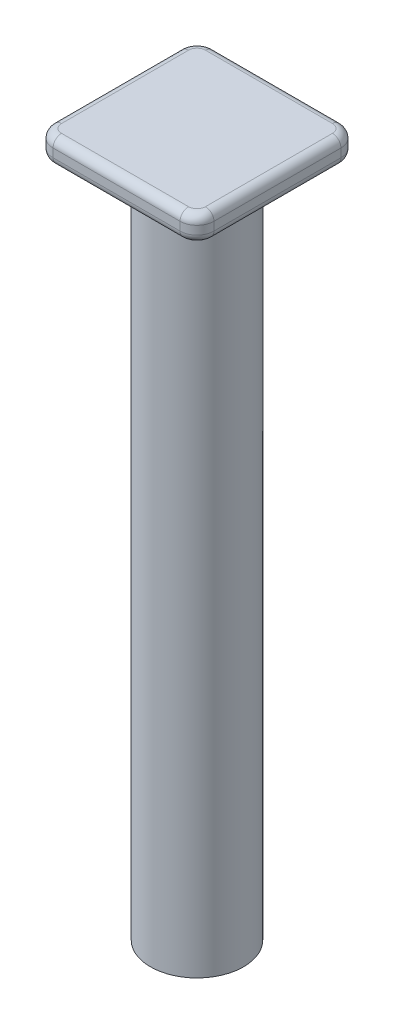
ISO-10303-21;
HEADER;
FILE_DESCRIPTION(('STEP AP214'),'2;1');
FILE_NAME('part.step','',(''),(''),'','','');
FILE_SCHEMA(('AUTOMOTIVE_DESIGN { 1 0 10303 214 1 1 1 1 }'));
ENDSEC;
DATA;
#1=APPLICATION_CONTEXT('core data for automotive mechanical design processes');
#2=APPLICATION_PROTOCOL_DEFINITION('international standard','automotive_design',2000,#1);
#3=PRODUCT_CONTEXT('',#1,'mechanical');
#4=PRODUCT('Part','Part','',(#3));
#5=PRODUCT_RELATED_PRODUCT_CATEGORY('part','',(#4));
#6=PRODUCT_DEFINITION_FORMATION('','',#4);
#7=PRODUCT_DEFINITION_CONTEXT('part definition',#1,'design');
#8=PRODUCT_DEFINITION('design','',#6,#7);
#9=PRODUCT_DEFINITION_SHAPE('','',#8);
#10=(LENGTH_UNIT() NAMED_UNIT(*) SI_UNIT(.MILLI.,.METRE.));
#11=(NAMED_UNIT(*) PLANE_ANGLE_UNIT() SI_UNIT($,.RADIAN.));
#12=(NAMED_UNIT(*) SI_UNIT($,.STERADIAN.) SOLID_ANGLE_UNIT());
#13=UNCERTAINTY_MEASURE_WITH_UNIT(LENGTH_MEASURE(1.E-05),#10,'distance_accuracy_value','');
#14=(GEOMETRIC_REPRESENTATION_CONTEXT(3) GLOBAL_UNCERTAINTY_ASSIGNED_CONTEXT((#13)) GLOBAL_UNIT_ASSIGNED_CONTEXT((#10,
#11,#12)) REPRESENTATION_CONTEXT('',''));
#15=CARTESIAN_POINT('',(0.,0.,0.));
#16=DIRECTION('',(0.,0.,1.));
#17=DIRECTION('',(1.,0.,0.));
#18=AXIS2_PLACEMENT_3D('',#15,#16,#17);
#19=CARTESIAN_POINT('',(7.14374999999999,12.587565422551,-7.14375));
#20=DIRECTION('',(0.,-1.,0.));
#21=DIRECTION('',(0.,0.,-1.));
#22=AXIS2_PLACEMENT_3D('',#19,#20,#21);
#23=CYLINDRICAL_SURFACE('',#22,1.905);
#24=DIRECTION('',(0.,-1.,0.));
#25=VECTOR('',#24,1.);
#26=CARTESIAN_POINT('',(9.04874999999999,12.587565422551,-7.14374999999999));
#27=LINE('',#26,#25);
#28=CARTESIAN_POINT('',(9.04874999999999,11.635065422551,-7.14374999999999));
#29=VERTEX_POINT('',#28);
#30=CARTESIAN_POINT('',(9.04874999999999,10.682565422551,-7.14374999999999));
#31=VERTEX_POINT('',#30);
#32=EDGE_CURVE('E253',#29,#31,#27,.T.);
#33=ORIENTED_EDGE('',*,*,#32,.T.);
#34=CARTESIAN_POINT('',(7.14374999999999,10.682565422551,-7.14375));
#35=DIRECTION('',(0.,-1.,0.));
#36=DIRECTION('',(0.,0.,-1.));
#37=AXIS2_PLACEMENT_3D('',#34,#35,#36);
#38=CIRCLE('',#37,1.905);
#39=CARTESIAN_POINT('',(7.14374999999998,10.682565422551,-9.04875));
#40=VERTEX_POINT('',#39);
#41=EDGE_CURVE('E171',#31,#40,#38,.F.);
#42=ORIENTED_EDGE('',*,*,#41,.T.);
#43=DIRECTION('',(0.,-1.,0.));
#44=VECTOR('',#43,1.);
#45=CARTESIAN_POINT('',(7.14374999999998,12.587565422551,-9.04875));
#46=LINE('',#45,#44);
#47=CARTESIAN_POINT('',(7.14374999999998,11.635065422551,-9.04875));
#48=VERTEX_POINT('',#47);
#49=EDGE_CURVE('E154',#48,#40,#46,.T.);
#50=ORIENTED_EDGE('',*,*,#49,.F.);
#51=CARTESIAN_POINT('',(7.14374999999999,11.635065422551,-7.14375));
#52=DIRECTION('',(0.,-1.,0.));
#53=DIRECTION('',(0.,0.,-1.));
#54=AXIS2_PLACEMENT_3D('',#51,#52,#53);
#55=CIRCLE('',#54,1.905);
#56=EDGE_CURVE('E168',#48,#29,#55,.T.);
#57=ORIENTED_EDGE('',*,*,#56,.T.);
#58=EDGE_LOOP('',(#33,#42,#50,#57));
#59=FACE_BOUND('',#58,.T.);
#60=ADVANCED_FACE('F37',(#59),#23,.T.);
#61=CARTESIAN_POINT('',(-7.14375,12.587565422551,-9.04875));
#62=DIRECTION('',(0.,0.,1.));
#63=DIRECTION('',(1.,0.,0.));
#64=AXIS2_PLACEMENT_3D('',#61,#62,#63);
#65=PLANE('',#64);
#66=ORIENTED_EDGE('',*,*,#49,.T.);
#67=DIRECTION('',(-1.,0.,0.));
#68=VECTOR('',#67,1.);
#69=CARTESIAN_POINT('',(-7.14375,10.682565422551,-9.04875));
#70=LINE('',#69,#68);
#71=CARTESIAN_POINT('',(-7.14375,10.682565422551,-9.04875));
#72=VERTEX_POINT('',#71);
#73=EDGE_CURVE('E11',#40,#72,#70,.T.);
#74=ORIENTED_EDGE('',*,*,#73,.T.);
#75=DIRECTION('',(0.,-1.,0.));
#76=VECTOR('',#75,1.);
#77=CARTESIAN_POINT('',(-7.14375,12.587565422551,-9.04875));
#78=LINE('',#77,#76);
#79=CARTESIAN_POINT('',(-7.14375,11.635065422551,-9.04875));
#80=VERTEX_POINT('',#79);
#81=EDGE_CURVE('E156',#80,#72,#78,.T.);
#82=ORIENTED_EDGE('',*,*,#81,.F.);
#83=DIRECTION('',(-1.,0.,0.));
#84=VECTOR('',#83,1.);
#85=CARTESIAN_POINT('',(-7.14375,11.635065422551,-9.04875));
#86=LINE('',#85,#84);
#87=EDGE_CURVE('E46',#80,#48,#86,.F.);
#88=ORIENTED_EDGE('',*,*,#87,.T.);
#89=EDGE_LOOP('',(#66,#74,#82,#88));
#90=FACE_BOUND('',#89,.T.);
#91=ADVANCED_FACE('F153',(#90),#65,.F.);
#92=CARTESIAN_POINT('',(-7.14375000000001,12.587565422551,-7.14375));
#93=DIRECTION('',(0.,-1.,0.));
#94=DIRECTION('',(0.,0.,-1.));
#95=AXIS2_PLACEMENT_3D('',#92,#93,#94);
#96=CYLINDRICAL_SURFACE('',#95,1.905);
#97=ORIENTED_EDGE('',*,*,#81,.T.);
#98=CARTESIAN_POINT('',(-7.14375000000001,10.682565422551,-7.14375));
#99=DIRECTION('',(0.,-1.,0.));
#100=DIRECTION('',(0.,0.,-1.));
#101=AXIS2_PLACEMENT_3D('',#98,#99,#100);
#102=CIRCLE('',#101,1.905);
#103=CARTESIAN_POINT('',(-9.04875000000001,10.682565422551,-7.14374999999999));
#104=VERTEX_POINT('',#103);
#105=EDGE_CURVE('E314',#72,#104,#102,.F.);
#106=ORIENTED_EDGE('',*,*,#105,.T.);
#107=DIRECTION('',(0.,-1.,0.));
#108=VECTOR('',#107,1.);
#109=CARTESIAN_POINT('',(-9.04875000000001,12.587565422551,-7.14374999999999));
#110=LINE('',#109,#108);
#111=CARTESIAN_POINT('',(-9.04875000000001,11.635065422551,-7.14374999999999));
#112=VERTEX_POINT('',#111);
#113=EDGE_CURVE('E268',#112,#104,#110,.T.);
#114=ORIENTED_EDGE('',*,*,#113,.F.);
#115=CARTESIAN_POINT('',(-7.14375000000001,11.635065422551,-7.14375));
#116=DIRECTION('',(0.,-1.,0.));
#117=DIRECTION('',(0.,0.,-1.));
#118=AXIS2_PLACEMENT_3D('',#115,#116,#117);
#119=CIRCLE('',#118,1.905);
#120=EDGE_CURVE('E312',#112,#80,#119,.T.);
#121=ORIENTED_EDGE('',*,*,#120,.T.);
#122=EDGE_LOOP('',(#97,#106,#114,#121));
#123=FACE_BOUND('',#122,.T.);
#124=ADVANCED_FACE('F376',(#123),#96,.T.);
#125=CARTESIAN_POINT('',(-9.04875000000001,12.587565422551,7.14374999999999));
#126=DIRECTION('',(1.,0.,0.));
#127=DIRECTION('',(0.,0.,-1.));
#128=AXIS2_PLACEMENT_3D('',#125,#126,#127);
#129=PLANE('',#128);
#130=ORIENTED_EDGE('',*,*,#113,.T.);
#131=DIRECTION('',(0.,0.,1.));
#132=VECTOR('',#131,1.);
#133=CARTESIAN_POINT('',(-9.04875000000001,10.682565422551,7.14374999999999));
#134=LINE('',#133,#132);
#135=CARTESIAN_POINT('',(-9.04875000000001,10.682565422551,7.14374999999999));
#136=VERTEX_POINT('',#135);
#137=EDGE_CURVE('E310',#104,#136,#134,.T.);
#138=ORIENTED_EDGE('',*,*,#137,.T.);
#139=DIRECTION('',(0.,-1.,0.));
#140=VECTOR('',#139,1.);
#141=CARTESIAN_POINT('',(-9.04875000000001,12.587565422551,7.14374999999999));
#142=LINE('',#141,#140);
#143=CARTESIAN_POINT('',(-9.04875000000001,11.635065422551,7.14374999999999));
#144=VERTEX_POINT('',#143);
#145=EDGE_CURVE('E265',#144,#136,#142,.T.);
#146=ORIENTED_EDGE('',*,*,#145,.F.);
#147=DIRECTION('',(0.,0.,1.));
#148=VECTOR('',#147,1.);
#149=CARTESIAN_POINT('',(-9.04875000000001,11.635065422551,7.14374999999999));
#150=LINE('',#149,#148);
#151=EDGE_CURVE('E308',#144,#112,#150,.F.);
#152=ORIENTED_EDGE('',*,*,#151,.T.);
#153=EDGE_LOOP('',(#130,#138,#146,#152));
#154=FACE_BOUND('',#153,.T.);
#155=ADVANCED_FACE('F381',(#154),#129,.F.);
#156=CARTESIAN_POINT('',(-7.14375000000001,12.587565422551,7.14375));
#157=DIRECTION('',(0.,-1.,0.));
#158=DIRECTION('',(0.,0.,-1.));
#159=AXIS2_PLACEMENT_3D('',#156,#157,#158);
#160=CYLINDRICAL_SURFACE('',#159,1.905);
#161=ORIENTED_EDGE('',*,*,#145,.T.);
#162=CARTESIAN_POINT('',(-7.14375000000001,10.682565422551,7.14375));
#163=DIRECTION('',(0.,-1.,0.));
#164=DIRECTION('',(0.,0.,-1.));
#165=AXIS2_PLACEMENT_3D('',#162,#163,#164);
#166=CIRCLE('',#165,1.905);
#167=CARTESIAN_POINT('',(-7.14375000000001,10.682565422551,9.04875));
#168=VERTEX_POINT('',#167);
#169=EDGE_CURVE('E306',#136,#168,#166,.F.);
#170=ORIENTED_EDGE('',*,*,#169,.T.);
#171=DIRECTION('',(0.,-1.,0.));
#172=VECTOR('',#171,1.);
#173=CARTESIAN_POINT('',(-7.14375000000001,12.587565422551,9.04875));
#174=LINE('',#173,#172);
#175=CARTESIAN_POINT('',(-7.14375000000001,11.635065422551,9.04875));
#176=VERTEX_POINT('',#175);
#177=EDGE_CURVE('E262',#176,#168,#174,.T.);
#178=ORIENTED_EDGE('',*,*,#177,.F.);
#179=CARTESIAN_POINT('',(-7.14375000000001,11.635065422551,7.14375));
#180=DIRECTION('',(0.,-1.,0.));
#181=DIRECTION('',(0.,0.,-1.));
#182=AXIS2_PLACEMENT_3D('',#179,#180,#181);
#183=CIRCLE('',#182,1.905);
#184=EDGE_CURVE('E304',#176,#144,#183,.T.);
#185=ORIENTED_EDGE('',*,*,#184,.T.);
#186=EDGE_LOOP('',(#161,#170,#178,#185));
#187=FACE_BOUND('',#186,.T.);
#188=ADVANCED_FACE('F385',(#187),#160,.T.);
#189=CARTESIAN_POINT('',(-7.14375,12.587565422551,9.04875));
#190=DIRECTION('',(0.,0.,-1.));
#191=DIRECTION('',(-1.,0.,0.));
#192=AXIS2_PLACEMENT_3D('',#189,#190,#191);
#193=PLANE('',#192);
#194=ORIENTED_EDGE('',*,*,#177,.T.);
#195=DIRECTION('',(1.,0.,0.));
#196=VECTOR('',#195,1.);
#197=CARTESIAN_POINT('',(7.14374999999998,10.682565422551,9.04875));
#198=LINE('',#197,#196);
#199=CARTESIAN_POINT('',(7.14374999999998,10.682565422551,9.04875));
#200=VERTEX_POINT('',#199);
#201=EDGE_CURVE('E302',#168,#200,#198,.T.);
#202=ORIENTED_EDGE('',*,*,#201,.T.);
#203=DIRECTION('',(0.,-1.,0.));
#204=VECTOR('',#203,1.);
#205=CARTESIAN_POINT('',(7.14374999999998,12.587565422551,9.04875));
#206=LINE('',#205,#204);
#207=CARTESIAN_POINT('',(7.14374999999998,11.635065422551,9.04875));
#208=VERTEX_POINT('',#207);
#209=EDGE_CURVE('E259',#208,#200,#206,.T.);
#210=ORIENTED_EDGE('',*,*,#209,.F.);
#211=DIRECTION('',(1.,0.,0.));
#212=VECTOR('',#211,1.);
#213=CARTESIAN_POINT('',(-7.14375,11.635065422551,9.04875));
#214=LINE('',#213,#212);
#215=EDGE_CURVE('E300',#208,#176,#214,.F.);
#216=ORIENTED_EDGE('',*,*,#215,.T.);
#217=EDGE_LOOP('',(#194,#202,#210,#216));
#218=FACE_BOUND('',#217,.T.);
#219=ADVANCED_FACE('F389',(#218),#193,.F.);
#220=CARTESIAN_POINT('',(7.14374999999999,12.587565422551,7.14375));
#221=DIRECTION('',(0.,-1.,0.));
#222=DIRECTION('',(0.,0.,-1.));
#223=AXIS2_PLACEMENT_3D('',#220,#221,#222);
#224=CYLINDRICAL_SURFACE('',#223,1.905);
#225=ORIENTED_EDGE('',*,*,#209,.T.);
#226=CARTESIAN_POINT('',(7.14374999999999,10.682565422551,7.14375));
#227=DIRECTION('',(0.,-1.,0.));
#228=DIRECTION('',(0.,0.,-1.));
#229=AXIS2_PLACEMENT_3D('',#226,#227,#228);
#230=CIRCLE('',#229,1.905);
#231=CARTESIAN_POINT('',(9.04874999999999,10.682565422551,7.14374999999999));
#232=VERTEX_POINT('',#231);
#233=EDGE_CURVE('E298',#200,#232,#230,.F.);
#234=ORIENTED_EDGE('',*,*,#233,.T.);
#235=DIRECTION('',(0.,-1.,0.));
#236=VECTOR('',#235,1.);
#237=CARTESIAN_POINT('',(9.04874999999999,12.587565422551,7.14374999999999));
#238=LINE('',#237,#236);
#239=CARTESIAN_POINT('',(9.04874999999999,11.635065422551,7.14374999999999));
#240=VERTEX_POINT('',#239);
#241=EDGE_CURVE('E256',#240,#232,#238,.T.);
#242=ORIENTED_EDGE('',*,*,#241,.F.);
#243=CARTESIAN_POINT('',(7.14374999999999,11.635065422551,7.14375));
#244=DIRECTION('',(0.,-1.,0.));
#245=DIRECTION('',(0.,0.,-1.));
#246=AXIS2_PLACEMENT_3D('',#243,#244,#245);
#247=CIRCLE('',#246,1.905);
#248=EDGE_CURVE('E296',#240,#208,#247,.T.);
#249=ORIENTED_EDGE('',*,*,#248,.T.);
#250=EDGE_LOOP('',(#225,#234,#242,#249));
#251=FACE_BOUND('',#250,.T.);
#252=ADVANCED_FACE('F349',(#251),#224,.T.);
#253=CARTESIAN_POINT('',(9.04874999999999,12.587565422551,7.14374999999999));
#254=DIRECTION('',(-1.,0.,0.));
#255=DIRECTION('',(0.,0.,1.));
#256=AXIS2_PLACEMENT_3D('',#253,#254,#255);
#257=PLANE('',#256);
#258=ORIENTED_EDGE('',*,*,#241,.T.);
#259=DIRECTION('',(0.,0.,-1.));
#260=VECTOR('',#259,1.);
#261=CARTESIAN_POINT('',(9.04874999999999,10.682565422551,-7.14374999999999));
#262=LINE('',#261,#260);
#263=EDGE_CURVE('E294',#232,#31,#262,.T.);
#264=ORIENTED_EDGE('',*,*,#263,.T.);
#265=ORIENTED_EDGE('',*,*,#32,.F.);
#266=DIRECTION('',(0.,0.,-1.));
#267=VECTOR('',#266,1.);
#268=CARTESIAN_POINT('',(9.04874999999999,11.635065422551,7.14374999999999));
#269=LINE('',#268,#267);
#270=EDGE_CURVE('E292',#29,#240,#269,.F.);
#271=ORIENTED_EDGE('',*,*,#270,.T.);
#272=EDGE_LOOP('',(#258,#264,#265,#271));
#273=FACE_BOUND('',#272,.T.);
#274=ADVANCED_FACE('F346',(#273),#257,.F.);
#275=CARTESIAN_POINT('',(7.14374999999999,12.587565422551,-7.14375));
#276=DIRECTION('',(0.,-1.,0.));
#277=DIRECTION('',(0.,0.,-1.));
#278=AXIS2_PLACEMENT_3D('',#275,#276,#277);
#279=PLANE('',#278);
#280=DIRECTION('',(0.,0.,-1.));
#281=VECTOR('',#280,1.);
#282=CARTESIAN_POINT('',(8.09624999999999,12.587565422551,-7.14375));
#283=LINE('',#282,#281);
#284=CARTESIAN_POINT('',(8.09624999999999,12.587565422551,7.14374999999999));
#285=VERTEX_POINT('',#284);
#286=CARTESIAN_POINT('',(8.09624999999999,12.587565422551,-7.14375));
#287=VERTEX_POINT('',#286);
#288=EDGE_CURVE('E54',#285,#287,#283,.T.);
#289=ORIENTED_EDGE('',*,*,#288,.T.);
#290=CARTESIAN_POINT('',(7.14374999999999,12.587565422551,-7.14375));
#291=DIRECTION('',(0.,-1.,0.));
#292=DIRECTION('',(0.,0.,-1.));
#293=AXIS2_PLACEMENT_3D('',#290,#291,#292);
#294=CIRCLE('',#293,0.9525);
#295=CARTESIAN_POINT('',(7.14374999999998,12.587565422551,-8.09625));
#296=VERTEX_POINT('',#295);
#297=EDGE_CURVE('E161',#287,#296,#294,.F.);
#298=ORIENTED_EDGE('',*,*,#297,.T.);
#299=DIRECTION('',(-1.,0.,0.));
#300=VECTOR('',#299,1.);
#301=CARTESIAN_POINT('',(7.14374999999999,12.587565422551,-8.09625));
#302=LINE('',#301,#300);
#303=CARTESIAN_POINT('',(-7.14375,12.587565422551,-8.09625));
#304=VERTEX_POINT('',#303);
#305=EDGE_CURVE('E183',#296,#304,#302,.T.);
#306=ORIENTED_EDGE('',*,*,#305,.T.);
#307=CARTESIAN_POINT('',(-7.14375000000001,12.587565422551,-7.14375));
#308=DIRECTION('',(0.,-1.,0.));
#309=DIRECTION('',(0.,0.,-1.));
#310=AXIS2_PLACEMENT_3D('',#307,#308,#309);
#311=CIRCLE('',#310,0.9525);
#312=CARTESIAN_POINT('',(-8.09625000000001,12.587565422551,-7.14374999999999));
#313=VERTEX_POINT('',#312);
#314=EDGE_CURVE('E317',#304,#313,#311,.F.);
#315=ORIENTED_EDGE('',*,*,#314,.T.);
#316=DIRECTION('',(0.,0.,1.));
#317=VECTOR('',#316,1.);
#318=CARTESIAN_POINT('',(-8.09625000000001,12.587565422551,-7.14375));
#319=LINE('',#318,#317);
#320=CARTESIAN_POINT('',(-8.09625000000001,12.587565422551,7.14374999999999));
#321=VERTEX_POINT('',#320);
#322=EDGE_CURVE('E319',#313,#321,#319,.T.);
#323=ORIENTED_EDGE('',*,*,#322,.T.);
#324=CARTESIAN_POINT('',(-7.14375000000001,12.587565422551,7.14375));
#325=DIRECTION('',(0.,-1.,0.));
#326=DIRECTION('',(0.,0.,-1.));
#327=AXIS2_PLACEMENT_3D('',#324,#325,#326);
#328=CIRCLE('',#327,0.9525);
#329=CARTESIAN_POINT('',(-7.14375000000001,12.587565422551,8.09625));
#330=VERTEX_POINT('',#329);
#331=EDGE_CURVE('E321',#321,#330,#328,.F.);
#332=ORIENTED_EDGE('',*,*,#331,.T.);
#333=DIRECTION('',(1.,0.,0.));
#334=VECTOR('',#333,1.);
#335=CARTESIAN_POINT('',(7.14374999999999,12.587565422551,8.09625));
#336=LINE('',#335,#334);
#337=CARTESIAN_POINT('',(7.14374999999998,12.587565422551,8.09625));
#338=VERTEX_POINT('',#337);
#339=EDGE_CURVE('E323',#330,#338,#336,.T.);
#340=ORIENTED_EDGE('',*,*,#339,.T.);
#341=CARTESIAN_POINT('',(7.14374999999999,12.587565422551,7.14375));
#342=DIRECTION('',(0.,-1.,0.));
#343=DIRECTION('',(0.,0.,-1.));
#344=AXIS2_PLACEMENT_3D('',#341,#342,#343);
#345=CIRCLE('',#344,0.9525);
#346=EDGE_CURVE('E59',#338,#285,#345,.F.);
#347=ORIENTED_EDGE('',*,*,#346,.T.);
#348=EDGE_LOOP('',(#289,#298,#306,#315,#323,#332,#340,#347));
#349=FACE_BOUND('',#348,.T.);
#350=ADVANCED_FACE('F327',(#349),#279,.F.);
#351=CARTESIAN_POINT('',(7.14374999999999,9.73006542255102,-7.14375));
#352=DIRECTION('',(0.,-1.,0.));
#353=DIRECTION('',(0.,0.,-1.));
#354=AXIS2_PLACEMENT_3D('',#351,#352,#353);
#355=PLANE('',#354);
#356=DIRECTION('',(-1.,0.,0.));
#357=VECTOR('',#356,1.);
#358=CARTESIAN_POINT('',(7.14374999999998,9.73006542255102,-8.09625));
#359=LINE('',#358,#357);
#360=CARTESIAN_POINT('',(-7.14375,9.73006542255102,-8.09625));
#361=VERTEX_POINT('',#360);
#362=CARTESIAN_POINT('',(7.14374999999998,9.73006542255102,-8.09625));
#363=VERTEX_POINT('',#362);
#364=EDGE_CURVE('E275',#361,#363,#359,.F.);
#365=ORIENTED_EDGE('',*,*,#364,.T.);
#366=CARTESIAN_POINT('',(7.14374999999999,9.73006542255102,-7.14375));
#367=DIRECTION('',(0.,-1.,0.));
#368=DIRECTION('',(0.,0.,-1.));
#369=AXIS2_PLACEMENT_3D('',#366,#367,#368);
#370=CIRCLE('',#369,0.9525);
#371=CARTESIAN_POINT('',(8.09624999999999,9.73006542255102,-7.14375));
#372=VERTEX_POINT('',#371);
#373=EDGE_CURVE('E289',#363,#372,#370,.T.);
#374=ORIENTED_EDGE('',*,*,#373,.T.);
#375=DIRECTION('',(0.,0.,-1.));
#376=VECTOR('',#375,1.);
#377=CARTESIAN_POINT('',(8.09624999999999,9.73006542255102,7.14374999999999));
#378=LINE('',#377,#376);
#379=CARTESIAN_POINT('',(8.09624999999999,9.73006542255102,7.14374999999999));
#380=VERTEX_POINT('',#379);
#381=EDGE_CURVE('E287',#372,#380,#378,.F.);
#382=ORIENTED_EDGE('',*,*,#381,.T.);
#383=CARTESIAN_POINT('',(7.14374999999999,9.73006542255102,7.14375));
#384=DIRECTION('',(0.,-1.,0.));
#385=DIRECTION('',(0.,0.,-1.));
#386=AXIS2_PLACEMENT_3D('',#383,#384,#385);
#387=CIRCLE('',#386,0.9525);
#388=CARTESIAN_POINT('',(7.14374999999998,9.73006542255102,8.09625));
#389=VERTEX_POINT('',#388);
#390=EDGE_CURVE('E285',#380,#389,#387,.T.);
#391=ORIENTED_EDGE('',*,*,#390,.T.);
#392=DIRECTION('',(1.,0.,0.));
#393=VECTOR('',#392,1.);
#394=CARTESIAN_POINT('',(-7.14375000000001,9.73006542255102,8.09625));
#395=LINE('',#394,#393);
#396=CARTESIAN_POINT('',(-7.14375000000001,9.73006542255102,8.09625));
#397=VERTEX_POINT('',#396);
#398=EDGE_CURVE('E283',#389,#397,#395,.F.);
#399=ORIENTED_EDGE('',*,*,#398,.T.);
#400=CARTESIAN_POINT('',(-7.14375000000001,9.73006542255102,7.14375));
#401=DIRECTION('',(0.,-1.,0.));
#402=DIRECTION('',(0.,0.,-1.));
#403=AXIS2_PLACEMENT_3D('',#400,#401,#402);
#404=CIRCLE('',#403,0.9525);
#405=CARTESIAN_POINT('',(-8.09625000000001,9.73006542255102,7.14374999999999));
#406=VERTEX_POINT('',#405);
#407=EDGE_CURVE('E281',#397,#406,#404,.T.);
#408=ORIENTED_EDGE('',*,*,#407,.T.);
#409=DIRECTION('',(0.,0.,1.));
#410=VECTOR('',#409,1.);
#411=CARTESIAN_POINT('',(-8.09625000000001,9.73006542255102,-7.14374999999999));
#412=LINE('',#411,#410);
#413=CARTESIAN_POINT('',(-8.09625000000001,9.73006542255102,-7.14374999999999));
#414=VERTEX_POINT('',#413);
#415=EDGE_CURVE('E279',#406,#414,#412,.F.);
#416=ORIENTED_EDGE('',*,*,#415,.T.);
#417=CARTESIAN_POINT('',(-7.14375000000001,9.73006542255102,-7.14375));
#418=DIRECTION('',(0.,-1.,0.));
#419=DIRECTION('',(0.,0.,-1.));
#420=AXIS2_PLACEMENT_3D('',#417,#418,#419);
#421=CIRCLE('',#420,0.9525);
#422=EDGE_CURVE('E277',#414,#361,#421,.T.);
#423=ORIENTED_EDGE('',*,*,#422,.T.);
#424=EDGE_LOOP('',(#365,#374,#382,#391,#399,#408,#416,#423));
#425=FACE_BOUND('',#424,.T.);
#426=CARTESIAN_POINT('',(0.,9.73006542255102,0.));
#427=DIRECTION('',(0.,-1.,0.));
#428=DIRECTION('',(0.,0.,-1.));
#429=AXIS2_PLACEMENT_3D('',#426,#427,#428);
#430=CIRCLE('',#429,5.23875);
#431=CARTESIAN_POINT('',(0.,9.73006542255102,-5.23875));
#432=VERTEX_POINT('',#431);
#433=EDGE_CURVE('E244',#432,#432,#430,.T.);
#434=ORIENTED_EDGE('',*,*,#433,.F.);
#435=EDGE_LOOP('',(#434));
#436=FACE_BOUND('',#435,.T.);
#437=ADVANCED_FACE('F398',(#425,#436),#355,.T.);
#438=CARTESIAN_POINT('',(0.,-66.469934577449,0.));
#439=DIRECTION('',(0.,-1.,0.));
#440=DIRECTION('',(0.,0.,-1.));
#441=AXIS2_PLACEMENT_3D('',#438,#439,#440);
#442=PLANE('',#441);
#443=CARTESIAN_POINT('',(0.,-66.469934577449,0.));
#444=DIRECTION('',(0.,-1.,0.));
#445=DIRECTION('',(0.,0.,-1.));
#446=AXIS2_PLACEMENT_3D('',#443,#444,#445);
#447=CIRCLE('',#446,5.23875);
#448=CARTESIAN_POINT('',(0.,-66.469934577449,-5.23875));
#449=VERTEX_POINT('',#448);
#450=EDGE_CURVE('E249',#449,#449,#447,.T.);
#451=ORIENTED_EDGE('',*,*,#450,.T.);
#452=EDGE_LOOP('',(#451));
#453=FACE_BOUND('',#452,.T.);
#454=CARTESIAN_POINT('',(0.,-66.469934577449,0.));
#455=DIRECTION('',(0.,-1.,0.));
#456=DIRECTION('',(0.,0.,-1.));
#457=AXIS2_PLACEMENT_3D('',#454,#455,#456);
#458=CIRCLE('',#457,3.81);
#459=CARTESIAN_POINT('',(0.,-66.469934577449,-3.81));
#460=VERTEX_POINT('',#459);
#461=EDGE_CURVE('E238',#460,#460,#458,.T.);
#462=ORIENTED_EDGE('',*,*,#461,.F.);
#463=EDGE_LOOP('',(#462));
#464=FACE_BOUND('',#463,.T.);
#465=ADVANCED_FACE('F401',(#453,#464),#442,.T.);
#466=CARTESIAN_POINT('',(0.,-66.469934577449,0.));
#467=DIRECTION('',(0.,1.,0.));
#468=DIRECTION('',(0.,0.,1.));
#469=AXIS2_PLACEMENT_3D('',#466,#467,#468);
#470=CYLINDRICAL_SURFACE('',#469,5.23875);
#471=ORIENTED_EDGE('',*,*,#450,.F.);
#472=EDGE_LOOP('',(#471));
#473=FACE_BOUND('',#472,.T.);
#474=ORIENTED_EDGE('',*,*,#433,.T.);
#475=EDGE_LOOP('',(#474));
#476=FACE_BOUND('',#475,.T.);
#477=ADVANCED_FACE('F406',(#473,#476),#470,.T.);
#478=CARTESIAN_POINT('',(0.,-66.469934577449,0.));
#479=DIRECTION('',(0.,1.,0.));
#480=DIRECTION('',(0.,0.,1.));
#481=AXIS2_PLACEMENT_3D('',#478,#479,#480);
#482=CYLINDRICAL_SURFACE('',#481,3.81);
#483=ORIENTED_EDGE('',*,*,#461,.T.);
#484=EDGE_LOOP('',(#483));
#485=FACE_BOUND('',#484,.T.);
#486=CARTESIAN_POINT('',(0.,9.73006542255102,0.));
#487=DIRECTION('',(0.,-1.,0.));
#488=DIRECTION('',(0.,0.,-1.));
#489=AXIS2_PLACEMENT_3D('',#486,#487,#488);
#490=CIRCLE('',#489,3.81);
#491=CARTESIAN_POINT('',(0.,9.73006542255102,-3.81));
#492=VERTEX_POINT('',#491);
#493=EDGE_CURVE('E172',#492,#492,#490,.F.);
#494=ORIENTED_EDGE('',*,*,#493,.T.);
#495=EDGE_LOOP('',(#494));
#496=FACE_BOUND('',#495,.T.);
#497=ADVANCED_FACE('F409',(#485,#496),#482,.F.);
#498=ORIENTED_EDGE('',*,*,#493,.F.);
#499=EDGE_LOOP('',(#498));
#500=FACE_BOUND('',#499,.T.);
#501=ADVANCED_FACE('F403',(#500),#355,.T.);
#502=CARTESIAN_POINT('',(-7.14375000000001,10.682565422551,7.14375));
#503=DIRECTION('',(0.,-1.,0.));
#504=DIRECTION('',(0.,0.,-1.));
#505=AXIS2_PLACEMENT_3D('',#502,#503,#504);
#506=TOROIDAL_SURFACE('',#505,0.9525,0.9525);
#507=CARTESIAN_POINT('',(-8.09625000000001,10.682565422551,7.14374999999999));
#508=DIRECTION('',(0.,0.,-1.));
#509=DIRECTION('',(-1.,0.,0.));
#510=AXIS2_PLACEMENT_3D('',#507,#508,#509);
#511=CIRCLE('',#510,0.9525);
#512=EDGE_CURVE('E231',#406,#136,#511,.T.);
#513=ORIENTED_EDGE('',*,*,#512,.F.);
#514=ORIENTED_EDGE('',*,*,#407,.F.);
#515=CARTESIAN_POINT('',(-7.14375000000001,10.682565422551,8.09625));
#516=DIRECTION('',(1.,0.,0.));
#517=DIRECTION('',(0.,0.,-1.));
#518=AXIS2_PLACEMENT_3D('',#515,#516,#517);
#519=CIRCLE('',#518,0.9525);
#520=EDGE_CURVE('E188',#168,#397,#519,.T.);
#521=ORIENTED_EDGE('',*,*,#520,.F.);
#522=ORIENTED_EDGE('',*,*,#169,.F.);
#523=EDGE_LOOP('',(#513,#514,#521,#522));
#524=FACE_BOUND('',#523,.T.);
#525=ADVANCED_FACE('F418',(#524),#506,.T.);
#526=CARTESIAN_POINT('',(-7.14375,10.682565422551,8.09625));
#527=DIRECTION('',(-1.,0.,0.));
#528=DIRECTION('',(0.,0.,1.));
#529=AXIS2_PLACEMENT_3D('',#526,#527,#528);
#530=CYLINDRICAL_SURFACE('',#529,0.9525);
#531=ORIENTED_EDGE('',*,*,#520,.T.);
#532=ORIENTED_EDGE('',*,*,#398,.F.);
#533=CARTESIAN_POINT('',(7.14374999999998,10.682565422551,8.09625));
#534=DIRECTION('',(1.,0.,0.));
#535=DIRECTION('',(0.,1.,0.));
#536=AXIS2_PLACEMENT_3D('',#533,#534,#535);
#537=CIRCLE('',#536,0.9525);
#538=EDGE_CURVE('E229',#200,#389,#537,.T.);
#539=ORIENTED_EDGE('',*,*,#538,.F.);
#540=ORIENTED_EDGE('',*,*,#201,.F.);
#541=EDGE_LOOP('',(#531,#532,#539,#540));
#542=FACE_BOUND('',#541,.T.);
#543=ADVANCED_FACE('F425',(#542),#530,.T.);
#544=CARTESIAN_POINT('',(-8.09625000000001,10.682565422551,7.14374999999999));
#545=DIRECTION('',(0.,0.,-1.));
#546=DIRECTION('',(-1.,0.,0.));
#547=AXIS2_PLACEMENT_3D('',#544,#545,#546);
#548=CYLINDRICAL_SURFACE('',#547,0.9525);
#549=ORIENTED_EDGE('',*,*,#512,.T.);
#550=ORIENTED_EDGE('',*,*,#137,.F.);
#551=CARTESIAN_POINT('',(-8.09625000000001,10.682565422551,-7.14374999999999));
#552=DIRECTION('',(0.,0.,-1.));
#553=DIRECTION('',(-1.,0.,0.));
#554=AXIS2_PLACEMENT_3D('',#551,#552,#553);
#555=CIRCLE('',#554,0.9525);
#556=EDGE_CURVE('E226',#414,#104,#555,.T.);
#557=ORIENTED_EDGE('',*,*,#556,.F.);
#558=ORIENTED_EDGE('',*,*,#415,.F.);
#559=EDGE_LOOP('',(#549,#550,#557,#558));
#560=FACE_BOUND('',#559,.T.);
#561=ADVANCED_FACE('F431',(#560),#548,.T.);
#562=CARTESIAN_POINT('',(7.14374999999999,10.682565422551,7.14375));
#563=DIRECTION('',(0.,-1.,0.));
#564=DIRECTION('',(0.,0.,-1.));
#565=AXIS2_PLACEMENT_3D('',#562,#563,#564);
#566=TOROIDAL_SURFACE('',#565,0.9525,0.9525);
#567=ORIENTED_EDGE('',*,*,#538,.T.);
#568=ORIENTED_EDGE('',*,*,#390,.F.);
#569=CARTESIAN_POINT('',(8.09624999999999,10.682565422551,7.14374999999999));
#570=DIRECTION('',(0.,0.,-1.));
#571=DIRECTION('',(0.,1.,0.));
#572=AXIS2_PLACEMENT_3D('',#569,#570,#571);
#573=CIRCLE('',#572,0.9525);
#574=EDGE_CURVE('E223',#232,#380,#573,.T.);
#575=ORIENTED_EDGE('',*,*,#574,.F.);
#576=ORIENTED_EDGE('',*,*,#233,.F.);
#577=EDGE_LOOP('',(#567,#568,#575,#576));
#578=FACE_BOUND('',#577,.T.);
#579=ADVANCED_FACE('F354',(#578),#566,.T.);
#580=CARTESIAN_POINT('',(-7.14375000000001,10.682565422551,-7.14375));
#581=DIRECTION('',(0.,-1.,0.));
#582=DIRECTION('',(0.,0.,-1.));
#583=AXIS2_PLACEMENT_3D('',#580,#581,#582);
#584=DEGENERATE_TOROIDAL_SURFACE('',#583,0.9525,0.9525,.T.);
#585=ORIENTED_EDGE('',*,*,#556,.T.);
#586=ORIENTED_EDGE('',*,*,#105,.F.);
#587=CARTESIAN_POINT('',(-7.14375,10.682565422551,-8.09625));
#588=DIRECTION('',(1.,0.,0.));
#589=DIRECTION('',(0.,0.,-1.));
#590=AXIS2_PLACEMENT_3D('',#587,#588,#589);
#591=CIRCLE('',#590,0.9525);
#592=EDGE_CURVE('E218',#361,#72,#591,.T.);
#593=ORIENTED_EDGE('',*,*,#592,.F.);
#594=ORIENTED_EDGE('',*,*,#422,.F.);
#595=EDGE_LOOP('',(#585,#586,#593,#594));
#596=FACE_BOUND('',#595,.T.);
#597=ADVANCED_FACE('F502',(#596),#584,.T.);
#598=CARTESIAN_POINT('',(8.09624999999999,10.682565422551,7.14374999999999));
#599=DIRECTION('',(0.,0.,1.));
#600=DIRECTION('',(1.,0.,0.));
#601=AXIS2_PLACEMENT_3D('',#598,#599,#600);
#602=CYLINDRICAL_SURFACE('',#601,0.9525);
#603=ORIENTED_EDGE('',*,*,#574,.T.);
#604=ORIENTED_EDGE('',*,*,#381,.F.);
#605=CARTESIAN_POINT('',(8.09624999999999,10.682565422551,-7.14374999999999));
#606=DIRECTION('',(0.,0.,-1.));
#607=DIRECTION('',(0.,1.,0.));
#608=AXIS2_PLACEMENT_3D('',#605,#606,#607);
#609=CIRCLE('',#608,0.9525);
#610=EDGE_CURVE('E212',#31,#372,#609,.T.);
#611=ORIENTED_EDGE('',*,*,#610,.F.);
#612=ORIENTED_EDGE('',*,*,#263,.F.);
#613=EDGE_LOOP('',(#603,#604,#611,#612));
#614=FACE_BOUND('',#613,.T.);
#615=ADVANCED_FACE('F360',(#614),#602,.T.);
#616=CARTESIAN_POINT('',(-7.14375,10.682565422551,-8.09625));
#617=DIRECTION('',(1.,0.,0.));
#618=DIRECTION('',(0.,0.,-1.));
#619=AXIS2_PLACEMENT_3D('',#616,#617,#618);
#620=CYLINDRICAL_SURFACE('',#619,0.9525);
#621=ORIENTED_EDGE('',*,*,#592,.T.);
#622=ORIENTED_EDGE('',*,*,#73,.F.);
#623=CARTESIAN_POINT('',(7.14374999999998,10.682565422551,-8.09625));
#624=DIRECTION('',(1.,0.,0.));
#625=DIRECTION('',(0.,0.,-1.));
#626=AXIS2_PLACEMENT_3D('',#623,#624,#625);
#627=CIRCLE('',#626,0.9525);
#628=EDGE_CURVE('E207',#363,#40,#627,.T.);
#629=ORIENTED_EDGE('',*,*,#628,.F.);
#630=ORIENTED_EDGE('',*,*,#364,.F.);
#631=EDGE_LOOP('',(#621,#622,#629,#630));
#632=FACE_BOUND('',#631,.T.);
#633=ADVANCED_FACE('F363',(#632),#620,.T.);
#634=CARTESIAN_POINT('',(7.14374999999999,10.682565422551,-7.14375));
#635=DIRECTION('',(0.,-1.,0.));
#636=DIRECTION('',(0.,0.,-1.));
#637=AXIS2_PLACEMENT_3D('',#634,#635,#636);
#638=TOROIDAL_SURFACE('',#637,0.9525,0.9525);
#639=ORIENTED_EDGE('',*,*,#610,.T.);
#640=ORIENTED_EDGE('',*,*,#373,.F.);
#641=ORIENTED_EDGE('',*,*,#628,.T.);
#642=ORIENTED_EDGE('',*,*,#41,.F.);
#643=EDGE_LOOP('',(#639,#640,#641,#642));
#644=FACE_BOUND('',#643,.T.);
#645=ADVANCED_FACE('F361',(#644),#638,.T.);
#646=CARTESIAN_POINT('',(-7.14375000000001,11.635065422551,7.14375));
#647=DIRECTION('',(0.,-1.,0.));
#648=DIRECTION('',(0.,0.,-1.));
#649=AXIS2_PLACEMENT_3D('',#646,#647,#648);
#650=TOROIDAL_SURFACE('',#649,0.9525,0.9525);
#651=CARTESIAN_POINT('',(-8.09625000000001,11.635065422551,7.14374999999999));
#652=DIRECTION('',(0.,0.,-1.));
#653=DIRECTION('',(-1.,0.,0.));
#654=AXIS2_PLACEMENT_3D('',#651,#652,#653);
#655=CIRCLE('',#654,0.9525);
#656=EDGE_CURVE('E200',#144,#321,#655,.T.);
#657=ORIENTED_EDGE('',*,*,#656,.F.);
#658=ORIENTED_EDGE('',*,*,#184,.F.);
#659=CARTESIAN_POINT('',(-7.14375000000001,11.635065422551,8.09625));
#660=DIRECTION('',(1.,0.,0.));
#661=DIRECTION('',(0.,0.,-1.));
#662=AXIS2_PLACEMENT_3D('',#659,#660,#661);
#663=CIRCLE('',#662,0.9525);
#664=EDGE_CURVE('E41',#330,#176,#663,.T.);
#665=ORIENTED_EDGE('',*,*,#664,.F.);
#666=ORIENTED_EDGE('',*,*,#331,.F.);
#667=EDGE_LOOP('',(#657,#658,#665,#666));
#668=FACE_BOUND('',#667,.T.);
#669=ADVANCED_FACE('F39',(#668),#650,.T.);
#670=CARTESIAN_POINT('',(7.14374999999999,11.635065422551,8.09625));
#671=DIRECTION('',(1.,0.,0.));
#672=DIRECTION('',(0.,0.,-1.));
#673=AXIS2_PLACEMENT_3D('',#670,#671,#672);
#674=CYLINDRICAL_SURFACE('',#673,0.9525);
#675=ORIENTED_EDGE('',*,*,#664,.T.);
#676=ORIENTED_EDGE('',*,*,#215,.F.);
#677=CARTESIAN_POINT('',(7.14374999999998,11.635065422551,8.09625));
#678=DIRECTION('',(1.,0.,0.));
#679=DIRECTION('',(0.,0.,-1.));
#680=AXIS2_PLACEMENT_3D('',#677,#678,#679);
#681=CIRCLE('',#680,0.9525);
#682=EDGE_CURVE('E198',#338,#208,#681,.T.);
#683=ORIENTED_EDGE('',*,*,#682,.F.);
#684=ORIENTED_EDGE('',*,*,#339,.F.);
#685=EDGE_LOOP('',(#675,#676,#683,#684));
#686=FACE_BOUND('',#685,.T.);
#687=ADVANCED_FACE('F338',(#686),#674,.T.);
#688=CARTESIAN_POINT('',(-8.09625000000001,11.635065422551,-7.14375));
#689=DIRECTION('',(0.,0.,1.));
#690=DIRECTION('',(1.,0.,0.));
#691=AXIS2_PLACEMENT_3D('',#688,#689,#690);
#692=CYLINDRICAL_SURFACE('',#691,0.9525);
#693=ORIENTED_EDGE('',*,*,#656,.T.);
#694=ORIENTED_EDGE('',*,*,#322,.F.);
#695=CARTESIAN_POINT('',(-8.09625000000001,11.635065422551,-7.14374999999999));
#696=DIRECTION('',(0.,0.,-1.));
#697=DIRECTION('',(-1.,0.,0.));
#698=AXIS2_PLACEMENT_3D('',#695,#696,#697);
#699=CIRCLE('',#698,0.9525);
#700=EDGE_CURVE('E195',#112,#313,#699,.T.);
#701=ORIENTED_EDGE('',*,*,#700,.F.);
#702=ORIENTED_EDGE('',*,*,#151,.F.);
#703=EDGE_LOOP('',(#693,#694,#701,#702));
#704=FACE_BOUND('',#703,.T.);
#705=ADVANCED_FACE('F333',(#704),#692,.T.);
#706=CARTESIAN_POINT('',(7.14374999999999,11.635065422551,7.14375));
#707=DIRECTION('',(0.,-1.,0.));
#708=DIRECTION('',(0.,0.,-1.));
#709=AXIS2_PLACEMENT_3D('',#706,#707,#708);
#710=TOROIDAL_SURFACE('',#709,0.9525,0.9525);
#711=ORIENTED_EDGE('',*,*,#682,.T.);
#712=ORIENTED_EDGE('',*,*,#248,.F.);
#713=CARTESIAN_POINT('',(8.09624999999999,11.635065422551,7.14374999999999));
#714=DIRECTION('',(0.,0.,-1.));
#715=DIRECTION('',(-1.,0.,0.));
#716=AXIS2_PLACEMENT_3D('',#713,#714,#715);
#717=CIRCLE('',#716,0.9525);
#718=EDGE_CURVE('E192',#285,#240,#717,.T.);
#719=ORIENTED_EDGE('',*,*,#718,.F.);
#720=ORIENTED_EDGE('',*,*,#346,.F.);
#721=EDGE_LOOP('',(#711,#712,#719,#720));
#722=FACE_BOUND('',#721,.T.);
#723=ADVANCED_FACE('F341',(#722),#710,.T.);
#724=CARTESIAN_POINT('',(-7.14375000000001,11.635065422551,-7.14375));
#725=DIRECTION('',(0.,-1.,0.));
#726=DIRECTION('',(0.,0.,-1.));
#727=AXIS2_PLACEMENT_3D('',#724,#725,#726);
#728=DEGENERATE_TOROIDAL_SURFACE('',#727,0.9525,0.9525,.T.);
#729=ORIENTED_EDGE('',*,*,#700,.T.);
#730=ORIENTED_EDGE('',*,*,#314,.F.);
#731=CARTESIAN_POINT('',(-7.14375,11.635065422551,-8.09625));
#732=DIRECTION('',(1.,0.,0.));
#733=DIRECTION('',(0.,0.,-1.));
#734=AXIS2_PLACEMENT_3D('',#731,#732,#733);
#735=CIRCLE('',#734,0.9525);
#736=EDGE_CURVE('E185',#80,#304,#735,.T.);
#737=ORIENTED_EDGE('',*,*,#736,.F.);
#738=ORIENTED_EDGE('',*,*,#120,.F.);
#739=EDGE_LOOP('',(#729,#730,#737,#738));
#740=FACE_BOUND('',#739,.T.);
#741=ADVANCED_FACE('F330',(#740),#728,.T.);
#742=CARTESIAN_POINT('',(8.09624999999999,11.635065422551,-7.14375));
#743=DIRECTION('',(0.,0.,-1.));
#744=DIRECTION('',(-1.,0.,0.));
#745=AXIS2_PLACEMENT_3D('',#742,#743,#744);
#746=CYLINDRICAL_SURFACE('',#745,0.9525);
#747=ORIENTED_EDGE('',*,*,#718,.T.);
#748=ORIENTED_EDGE('',*,*,#270,.F.);
#749=CARTESIAN_POINT('',(8.09624999999999,11.635065422551,-7.14375));
#750=DIRECTION('',(0.,0.,-1.));
#751=DIRECTION('',(-1.,0.,0.));
#752=AXIS2_PLACEMENT_3D('',#749,#750,#751);
#753=CIRCLE('',#752,0.9525);
#754=EDGE_CURVE('E179',#287,#29,#753,.T.);
#755=ORIENTED_EDGE('',*,*,#754,.F.);
#756=ORIENTED_EDGE('',*,*,#288,.F.);
#757=EDGE_LOOP('',(#747,#748,#755,#756));
#758=FACE_BOUND('',#757,.T.);
#759=ADVANCED_FACE('F343',(#758),#746,.T.);
#760=CARTESIAN_POINT('',(7.14374999999999,11.635065422551,-8.09625));
#761=DIRECTION('',(-1.,0.,0.));
#762=DIRECTION('',(0.,0.,1.));
#763=AXIS2_PLACEMENT_3D('',#760,#761,#762);
#764=CYLINDRICAL_SURFACE('',#763,0.9525);
#765=ORIENTED_EDGE('',*,*,#736,.T.);
#766=ORIENTED_EDGE('',*,*,#305,.F.);
#767=CARTESIAN_POINT('',(7.14374999999998,11.635065422551,-8.09625));
#768=DIRECTION('',(1.,0.,0.));
#769=DIRECTION('',(0.,1.,0.));
#770=AXIS2_PLACEMENT_3D('',#767,#768,#769);
#771=CIRCLE('',#770,0.9525);
#772=EDGE_CURVE('E177',#48,#296,#771,.T.);
#773=ORIENTED_EDGE('',*,*,#772,.F.);
#774=ORIENTED_EDGE('',*,*,#87,.F.);
#775=EDGE_LOOP('',(#765,#766,#773,#774));
#776=FACE_BOUND('',#775,.T.);
#777=ADVANCED_FACE('F182',(#776),#764,.T.);
#778=CARTESIAN_POINT('',(7.14374999999999,11.635065422551,-7.14375));
#779=DIRECTION('',(0.,-1.,0.));
#780=DIRECTION('',(0.,0.,-1.));
#781=AXIS2_PLACEMENT_3D('',#778,#779,#780);
#782=TOROIDAL_SURFACE('',#781,0.9525,0.9525);
#783=ORIENTED_EDGE('',*,*,#754,.T.);
#784=ORIENTED_EDGE('',*,*,#56,.F.);
#785=ORIENTED_EDGE('',*,*,#772,.T.);
#786=ORIENTED_EDGE('',*,*,#297,.F.);
#787=EDGE_LOOP('',(#783,#784,#785,#786));
#788=FACE_BOUND('',#787,.T.);
#789=ADVANCED_FACE('F175',(#788),#782,.T.);
#790=CLOSED_SHELL('',(#60,#91,#124,#155,#188,#219,#252,#274,#350,#437,#465,#477,#497,#501,#525,
#543,#561,#579,#597,#615,#633,#645,#669,#687,#705,#723,#741,#759,#777,#789));
#791=MANIFOLD_SOLID_BREP('B2',#790);
#792=ADVANCED_BREP_SHAPE_REPRESENTATION('',(#18,#791),#14);
#793=SHAPE_DEFINITION_REPRESENTATION(#9,#792);
ENDSEC;
END-ISO-10303-21;
